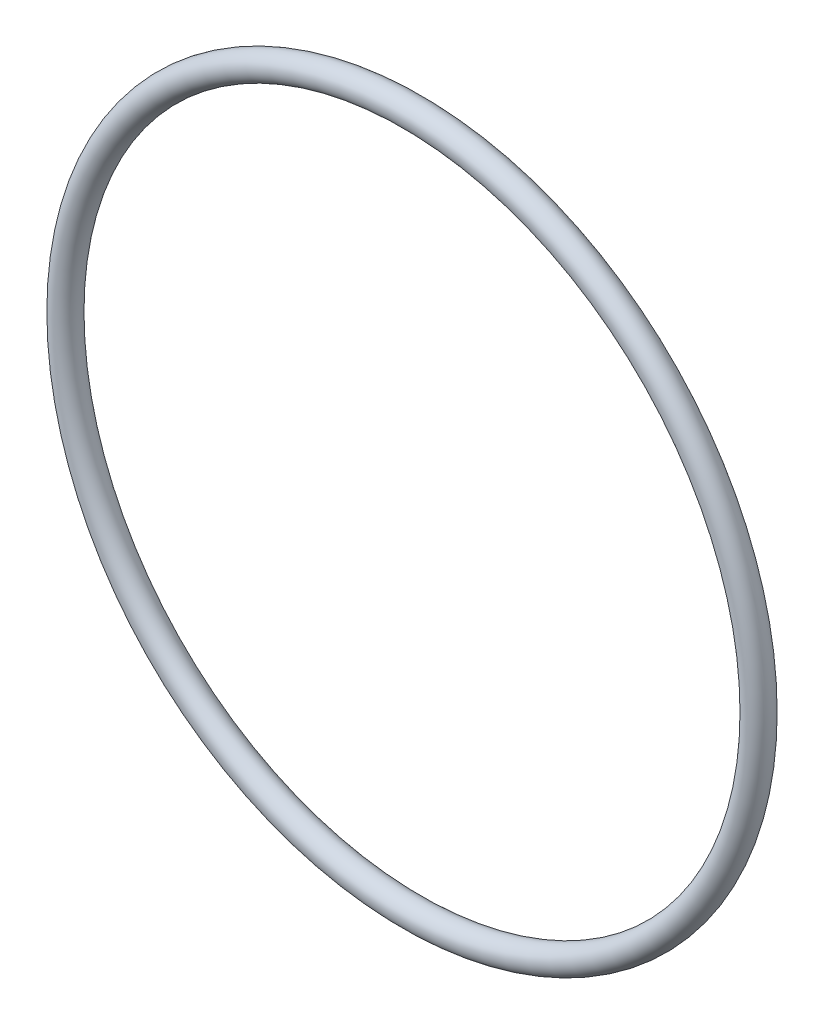
ISO-10303-21;
HEADER;
FILE_DESCRIPTION(('STEP AP214'),'2;1');
FILE_NAME('part.step','',(''),(''),'','','');
FILE_SCHEMA(('AUTOMOTIVE_DESIGN { 1 0 10303 214 1 1 1 1 }'));
ENDSEC;
DATA;
#1=APPLICATION_CONTEXT('core data for automotive mechanical design processes');
#2=APPLICATION_PROTOCOL_DEFINITION('international standard','automotive_design',2000,#1);
#3=PRODUCT_CONTEXT('',#1,'mechanical');
#4=PRODUCT('Part','Part','',(#3));
#5=PRODUCT_RELATED_PRODUCT_CATEGORY('part','',(#4));
#6=PRODUCT_DEFINITION_FORMATION('','',#4);
#7=PRODUCT_DEFINITION_CONTEXT('part definition',#1,'design');
#8=PRODUCT_DEFINITION('design','',#6,#7);
#9=PRODUCT_DEFINITION_SHAPE('','',#8);
#10=(LENGTH_UNIT() NAMED_UNIT(*) SI_UNIT(.MILLI.,.METRE.));
#11=(NAMED_UNIT(*) PLANE_ANGLE_UNIT() SI_UNIT($,.RADIAN.));
#12=(NAMED_UNIT(*) SI_UNIT($,.STERADIAN.) SOLID_ANGLE_UNIT());
#13=UNCERTAINTY_MEASURE_WITH_UNIT(LENGTH_MEASURE(1.E-05),#10,'distance_accuracy_value','');
#14=(GEOMETRIC_REPRESENTATION_CONTEXT(3) GLOBAL_UNCERTAINTY_ASSIGNED_CONTEXT((#13)) GLOBAL_UNIT_ASSIGNED_CONTEXT((#10,
#11,#12)) REPRESENTATION_CONTEXT('',''));
#15=CARTESIAN_POINT('',(0.,0.,0.));
#16=DIRECTION('',(0.,0.,1.));
#17=DIRECTION('',(1.,0.,0.));
#18=AXIS2_PLACEMENT_3D('',#15,#16,#17);
#19=CARTESIAN_POINT('',(0.,0.,0.));
#20=DIRECTION('',(0.,0.,1.));
#21=DIRECTION('',(1.,0.,0.));
#22=AXIS2_PLACEMENT_3D('',#19,#20,#21);
#23=TOROIDAL_SURFACE('',#22,92.075,3.49249999999999);
#24=CARTESIAN_POINT('',(95.5675,0.,0.));
#25=VERTEX_POINT('',#24);
#26=VERTEX_LOOP('',#25);
#27=FACE_BOUND('',#26,.T.);
#28=ADVANCED_FACE('F28',(#27),#23,.T.);
#29=CLOSED_SHELL('',(#28));
#30=MANIFOLD_SOLID_BREP('B2',#29);
#31=ADVANCED_BREP_SHAPE_REPRESENTATION('',(#18,#30),#14);
#32=SHAPE_DEFINITION_REPRESENTATION(#9,#31);
ENDSEC;
END-ISO-10303-21;
